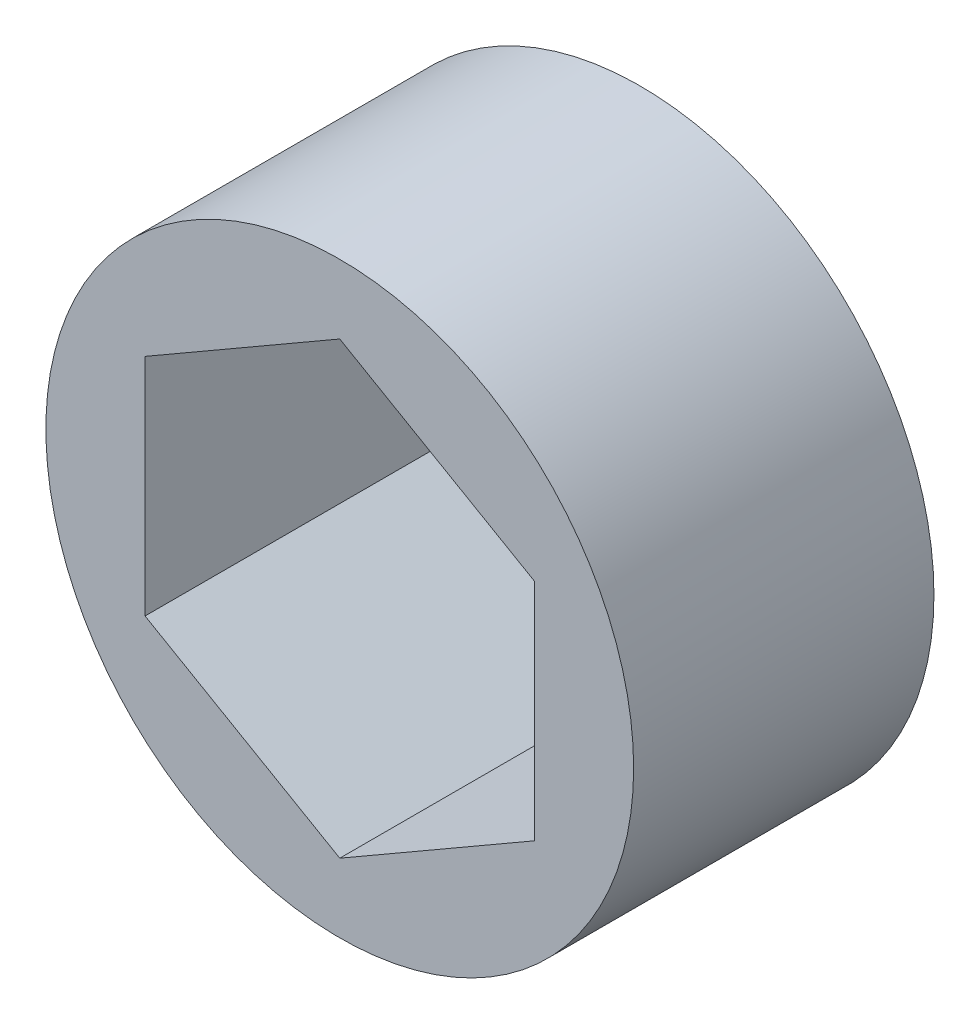
ISO-10303-21;
HEADER;
FILE_DESCRIPTION(('STEP AP214'),'2;1');
FILE_NAME('part.step','',(''),(''),'','','');
FILE_SCHEMA(('AUTOMOTIVE_DESIGN { 1 0 10303 214 1 1 1 1 }'));
ENDSEC;
DATA;
#1=APPLICATION_CONTEXT('core data for automotive mechanical design processes');
#2=APPLICATION_PROTOCOL_DEFINITION('international standard','automotive_design',2000,#1);
#3=PRODUCT_CONTEXT('',#1,'mechanical');
#4=PRODUCT('Part','Part','',(#3));
#5=PRODUCT_RELATED_PRODUCT_CATEGORY('part','',(#4));
#6=PRODUCT_DEFINITION_FORMATION('','',#4);
#7=PRODUCT_DEFINITION_CONTEXT('part definition',#1,'design');
#8=PRODUCT_DEFINITION('design','',#6,#7);
#9=PRODUCT_DEFINITION_SHAPE('','',#8);
#10=(LENGTH_UNIT() NAMED_UNIT(*) SI_UNIT(.MILLI.,.METRE.));
#11=(NAMED_UNIT(*) PLANE_ANGLE_UNIT() SI_UNIT($,.RADIAN.));
#12=(NAMED_UNIT(*) SI_UNIT($,.STERADIAN.) SOLID_ANGLE_UNIT());
#13=UNCERTAINTY_MEASURE_WITH_UNIT(LENGTH_MEASURE(1.E-05),#10,'distance_accuracy_value','');
#14=(GEOMETRIC_REPRESENTATION_CONTEXT(3) GLOBAL_UNCERTAINTY_ASSIGNED_CONTEXT((#13)) GLOBAL_UNIT_ASSIGNED_CONTEXT((#10,
#11,#12)) REPRESENTATION_CONTEXT('',''));
#15=CARTESIAN_POINT('',(0.,0.,0.));
#16=DIRECTION('',(0.,0.,1.));
#17=DIRECTION('',(1.,0.,0.));
#18=AXIS2_PLACEMENT_3D('',#15,#16,#17);
#19=CARTESIAN_POINT('',(0.,0.,10.381500192));
#20=DIRECTION('',(0.,0.,1.));
#21=DIRECTION('',(1.,0.,0.));
#22=AXIS2_PLACEMENT_3D('',#19,#20,#21);
#23=PLANE('',#22);
#24=CARTESIAN_POINT('',(0.,0.,10.381500192));
#25=DIRECTION('',(0.,0.,1.));
#26=DIRECTION('',(1.,0.,0.));
#27=AXIS2_PLACEMENT_3D('',#24,#25,#26);
#28=CIRCLE('',#27,10.16);
#29=CARTESIAN_POINT('',(10.16,0.,10.381500192));
#30=VERTEX_POINT('',#29);
#31=EDGE_CURVE('E11',#30,#30,#28,.T.);
#32=ORIENTED_EDGE('',*,*,#31,.T.);
#33=EDGE_LOOP('',(#32));
#34=FACE_BOUND('',#33,.T.);
#35=DIRECTION('',(-0.866025403784439,0.5,0.));
#36=VECTOR('',#35,1.);
#37=CARTESIAN_POINT('',(6.731,3.88614466191537,10.381500192));
#38=LINE('',#37,#36);
#39=CARTESIAN_POINT('',(6.731,3.88614466191537,10.381500192));
#40=VERTEX_POINT('',#39);
#41=CARTESIAN_POINT('',(0.,7.77228932383074,10.381500192));
#42=VERTEX_POINT('',#41);
#43=EDGE_CURVE('E100',#40,#42,#38,.T.);
#44=ORIENTED_EDGE('',*,*,#43,.F.);
#45=DIRECTION('',(0.,1.,0.));
#46=VECTOR('',#45,1.);
#47=CARTESIAN_POINT('',(6.731,-3.88614466191537,10.381500192));
#48=LINE('',#47,#46);
#49=CARTESIAN_POINT('',(6.731,-3.88614466191537,10.381500192));
#50=VERTEX_POINT('',#49);
#51=EDGE_CURVE('E92',#50,#40,#48,.T.);
#52=ORIENTED_EDGE('',*,*,#51,.F.);
#53=DIRECTION('',(0.866025403784439,0.5,0.));
#54=VECTOR('',#53,1.);
#55=CARTESIAN_POINT('',(0.,-7.77228932383074,10.381500192));
#56=LINE('',#55,#54);
#57=CARTESIAN_POINT('',(0.,-7.77228932383074,10.381500192));
#58=VERTEX_POINT('',#57);
#59=EDGE_CURVE('E120',#58,#50,#56,.T.);
#60=ORIENTED_EDGE('',*,*,#59,.F.);
#61=DIRECTION('',(0.866025403784439,-0.5,0.));
#62=VECTOR('',#61,1.);
#63=CARTESIAN_POINT('',(-6.731,-3.88614466191537,10.381500192));
#64=LINE('',#63,#62);
#65=CARTESIAN_POINT('',(-6.731,-3.88614466191537,10.381500192));
#66=VERTEX_POINT('',#65);
#67=EDGE_CURVE('E118',#66,#58,#64,.T.);
#68=ORIENTED_EDGE('',*,*,#67,.F.);
#69=DIRECTION('',(0.,-1.,0.));
#70=VECTOR('',#69,1.);
#71=CARTESIAN_POINT('',(-6.731,3.88614466191537,10.381500192));
#72=LINE('',#71,#70);
#73=CARTESIAN_POINT('',(-6.731,3.88614466191537,10.381500192));
#74=VERTEX_POINT('',#73);
#75=EDGE_CURVE('E114',#74,#66,#72,.T.);
#76=ORIENTED_EDGE('',*,*,#75,.F.);
#77=DIRECTION('',(-0.866025403784439,-0.5,0.));
#78=VECTOR('',#77,1.);
#79=CARTESIAN_POINT('',(0.,7.77228932383074,10.381500192));
#80=LINE('',#79,#78);
#81=EDGE_CURVE('E112',#42,#74,#80,.T.);
#82=ORIENTED_EDGE('',*,*,#81,.F.);
#83=EDGE_LOOP('',(#44,#52,#60,#68,#76,#82));
#84=FACE_BOUND('',#83,.T.);
#85=ADVANCED_FACE('F39',(#34,#84),#23,.T.);
#86=CARTESIAN_POINT('',(0.,0.,0.));
#87=DIRECTION('',(0.,0.,1.));
#88=DIRECTION('',(1.,0.,0.));
#89=AXIS2_PLACEMENT_3D('',#86,#87,#88);
#90=PLANE('',#89);
#91=CARTESIAN_POINT('',(0.,0.,0.));
#92=DIRECTION('',(0.,0.,1.));
#93=DIRECTION('',(1.,0.,0.));
#94=AXIS2_PLACEMENT_3D('',#91,#92,#93);
#95=CIRCLE('',#94,10.16);
#96=CARTESIAN_POINT('',(10.16,0.,0.));
#97=VERTEX_POINT('',#96);
#98=EDGE_CURVE('E43',#97,#97,#95,.T.);
#99=ORIENTED_EDGE('',*,*,#98,.F.);
#100=EDGE_LOOP('',(#99));
#101=FACE_BOUND('',#100,.T.);
#102=DIRECTION('',(0.,1.,0.));
#103=VECTOR('',#102,1.);
#104=CARTESIAN_POINT('',(6.731,-3.88614466191537,0.));
#105=LINE('',#104,#103);
#106=CARTESIAN_POINT('',(6.731,-3.88614466191537,0.));
#107=VERTEX_POINT('',#106);
#108=CARTESIAN_POINT('',(6.731,3.88614466191537,0.));
#109=VERTEX_POINT('',#108);
#110=EDGE_CURVE('E62',#107,#109,#105,.T.);
#111=ORIENTED_EDGE('',*,*,#110,.T.);
#112=DIRECTION('',(-0.866025403784439,0.5,0.));
#113=VECTOR('',#112,1.);
#114=CARTESIAN_POINT('',(6.731,3.88614466191537,0.));
#115=LINE('',#114,#113);
#116=CARTESIAN_POINT('',(0.,7.77228932383074,0.));
#117=VERTEX_POINT('',#116);
#118=EDGE_CURVE('E107',#109,#117,#115,.T.);
#119=ORIENTED_EDGE('',*,*,#118,.T.);
#120=DIRECTION('',(-0.866025403784439,-0.5,0.));
#121=VECTOR('',#120,1.);
#122=CARTESIAN_POINT('',(0.,7.77228932383074,0.));
#123=LINE('',#122,#121);
#124=CARTESIAN_POINT('',(-6.731,3.88614466191537,0.));
#125=VERTEX_POINT('',#124);
#126=EDGE_CURVE('E124',#117,#125,#123,.T.);
#127=ORIENTED_EDGE('',*,*,#126,.T.);
#128=DIRECTION('',(0.,-1.,0.));
#129=VECTOR('',#128,1.);
#130=CARTESIAN_POINT('',(-6.731,3.88614466191537,0.));
#131=LINE('',#130,#129);
#132=CARTESIAN_POINT('',(-6.731,-3.88614466191537,0.));
#133=VERTEX_POINT('',#132);
#134=EDGE_CURVE('E127',#125,#133,#131,.T.);
#135=ORIENTED_EDGE('',*,*,#134,.T.);
#136=DIRECTION('',(0.866025403784439,-0.5,0.));
#137=VECTOR('',#136,1.);
#138=CARTESIAN_POINT('',(-6.731,-3.88614466191537,0.));
#139=LINE('',#138,#137);
#140=CARTESIAN_POINT('',(0.,-7.77228932383074,0.));
#141=VERTEX_POINT('',#140);
#142=EDGE_CURVE('E130',#133,#141,#139,.T.);
#143=ORIENTED_EDGE('',*,*,#142,.T.);
#144=DIRECTION('',(0.866025403784439,0.5,0.));
#145=VECTOR('',#144,1.);
#146=CARTESIAN_POINT('',(0.,-7.77228932383074,0.));
#147=LINE('',#146,#145);
#148=EDGE_CURVE('E101',#141,#107,#147,.T.);
#149=ORIENTED_EDGE('',*,*,#148,.T.);
#150=EDGE_LOOP('',(#111,#119,#127,#135,#143,#149));
#151=FACE_BOUND('',#150,.T.);
#152=ADVANCED_FACE('F147',(#101,#151),#90,.F.);
#153=CARTESIAN_POINT('',(0.,0.,10.381500192));
#154=DIRECTION('',(0.,0.,-1.));
#155=DIRECTION('',(-1.,0.,0.));
#156=AXIS2_PLACEMENT_3D('',#153,#154,#155);
#157=CYLINDRICAL_SURFACE('',#156,10.16);
#158=ORIENTED_EDGE('',*,*,#31,.F.);
#159=EDGE_LOOP('',(#158));
#160=FACE_BOUND('',#159,.T.);
#161=ORIENTED_EDGE('',*,*,#98,.T.);
#162=EDGE_LOOP('',(#161));
#163=FACE_BOUND('',#162,.T.);
#164=ADVANCED_FACE('F41',(#160,#163),#157,.T.);
#165=CARTESIAN_POINT('',(6.731,-3.88614466191537,10.381500192));
#166=DIRECTION('',(-1.,0.,0.));
#167=DIRECTION('',(0.,-1.,0.));
#168=AXIS2_PLACEMENT_3D('',#165,#166,#167);
#169=PLANE('',#168);
#170=ORIENTED_EDGE('',*,*,#110,.F.);
#171=DIRECTION('',(0.,0.,-1.));
#172=VECTOR('',#171,1.);
#173=CARTESIAN_POINT('',(6.731,-3.88614466191537,10.381500192));
#174=LINE('',#173,#172);
#175=EDGE_CURVE('E96',#50,#107,#174,.T.);
#176=ORIENTED_EDGE('',*,*,#175,.F.);
#177=ORIENTED_EDGE('',*,*,#51,.T.);
#178=DIRECTION('',(0.,0.,-1.));
#179=VECTOR('',#178,1.);
#180=CARTESIAN_POINT('',(6.731,3.88614466191537,10.381500192));
#181=LINE('',#180,#179);
#182=EDGE_CURVE('E95',#40,#109,#181,.T.);
#183=ORIENTED_EDGE('',*,*,#182,.T.);
#184=EDGE_LOOP('',(#170,#176,#177,#183));
#185=FACE_BOUND('',#184,.T.);
#186=ADVANCED_FACE('F94',(#185),#169,.T.);
#187=CARTESIAN_POINT('',(6.731,3.88614466191537,10.381500192));
#188=DIRECTION('',(-0.5,-0.866025403784439,0.));
#189=DIRECTION('',(0.866025403784439,-0.5,0.));
#190=AXIS2_PLACEMENT_3D('',#187,#188,#189);
#191=PLANE('',#190);
#192=ORIENTED_EDGE('',*,*,#118,.F.);
#193=ORIENTED_EDGE('',*,*,#182,.F.);
#194=ORIENTED_EDGE('',*,*,#43,.T.);
#195=DIRECTION('',(0.,0.,-1.));
#196=VECTOR('',#195,1.);
#197=CARTESIAN_POINT('',(0.,7.77228932383074,10.381500192));
#198=LINE('',#197,#196);
#199=EDGE_CURVE('E108',#42,#117,#198,.T.);
#200=ORIENTED_EDGE('',*,*,#199,.T.);
#201=EDGE_LOOP('',(#192,#193,#194,#200));
#202=FACE_BOUND('',#201,.T.);
#203=ADVANCED_FACE('F104',(#202),#191,.T.);
#204=CARTESIAN_POINT('',(0.,7.77228932383074,10.381500192));
#205=DIRECTION('',(0.5,-0.866025403784439,0.));
#206=DIRECTION('',(0.866025403784439,0.5,0.));
#207=AXIS2_PLACEMENT_3D('',#204,#205,#206);
#208=PLANE('',#207);
#209=ORIENTED_EDGE('',*,*,#126,.F.);
#210=ORIENTED_EDGE('',*,*,#199,.F.);
#211=ORIENTED_EDGE('',*,*,#81,.T.);
#212=DIRECTION('',(0.,0.,-1.));
#213=VECTOR('',#212,1.);
#214=CARTESIAN_POINT('',(-6.731,3.88614466191537,10.381500192));
#215=LINE('',#214,#213);
#216=EDGE_CURVE('E139',#74,#125,#215,.T.);
#217=ORIENTED_EDGE('',*,*,#216,.T.);
#218=EDGE_LOOP('',(#209,#210,#211,#217));
#219=FACE_BOUND('',#218,.T.);
#220=ADVANCED_FACE('F143',(#219),#208,.T.);
#221=CARTESIAN_POINT('',(-6.731,3.88614466191537,10.381500192));
#222=DIRECTION('',(1.,0.,0.));
#223=DIRECTION('',(0.,1.,0.));
#224=AXIS2_PLACEMENT_3D('',#221,#222,#223);
#225=PLANE('',#224);
#226=ORIENTED_EDGE('',*,*,#134,.F.);
#227=ORIENTED_EDGE('',*,*,#216,.F.);
#228=ORIENTED_EDGE('',*,*,#75,.T.);
#229=DIRECTION('',(0.,0.,-1.));
#230=VECTOR('',#229,1.);
#231=CARTESIAN_POINT('',(-6.731,-3.88614466191537,10.381500192));
#232=LINE('',#231,#230);
#233=EDGE_CURVE('E137',#66,#133,#232,.T.);
#234=ORIENTED_EDGE('',*,*,#233,.T.);
#235=EDGE_LOOP('',(#226,#227,#228,#234));
#236=FACE_BOUND('',#235,.T.);
#237=ADVANCED_FACE('F155',(#236),#225,.T.);
#238=CARTESIAN_POINT('',(-6.731,-3.88614466191537,10.381500192));
#239=DIRECTION('',(0.5,0.866025403784439,0.));
#240=DIRECTION('',(-0.866025403784439,0.5,0.));
#241=AXIS2_PLACEMENT_3D('',#238,#239,#240);
#242=PLANE('',#241);
#243=ORIENTED_EDGE('',*,*,#142,.F.);
#244=ORIENTED_EDGE('',*,*,#233,.F.);
#245=ORIENTED_EDGE('',*,*,#67,.T.);
#246=DIRECTION('',(0.,0.,-1.));
#247=VECTOR('',#246,1.);
#248=CARTESIAN_POINT('',(0.,-7.77228932383074,10.381500192));
#249=LINE('',#248,#247);
#250=EDGE_CURVE('E54',#58,#141,#249,.T.);
#251=ORIENTED_EDGE('',*,*,#250,.T.);
#252=EDGE_LOOP('',(#243,#244,#245,#251));
#253=FACE_BOUND('',#252,.T.);
#254=ADVANCED_FACE('F153',(#253),#242,.T.);
#255=CARTESIAN_POINT('',(0.,-7.77228932383074,10.381500192));
#256=DIRECTION('',(-0.5,0.866025403784439,0.));
#257=DIRECTION('',(-0.866025403784439,-0.5,0.));
#258=AXIS2_PLACEMENT_3D('',#255,#256,#257);
#259=PLANE('',#258);
#260=ORIENTED_EDGE('',*,*,#148,.F.);
#261=ORIENTED_EDGE('',*,*,#250,.F.);
#262=ORIENTED_EDGE('',*,*,#59,.T.);
#263=ORIENTED_EDGE('',*,*,#175,.T.);
#264=EDGE_LOOP('',(#260,#261,#262,#263));
#265=FACE_BOUND('',#264,.T.);
#266=ADVANCED_FACE('F149',(#265),#259,.T.);
#267=CLOSED_SHELL('',(#85,#152,#164,#186,#203,#220,#237,#254,#266));
#268=MANIFOLD_SOLID_BREP('B2',#267);
#269=ADVANCED_BREP_SHAPE_REPRESENTATION('',(#18,#268),#14);
#270=SHAPE_DEFINITION_REPRESENTATION(#9,#269);
ENDSEC;
END-ISO-10303-21;
